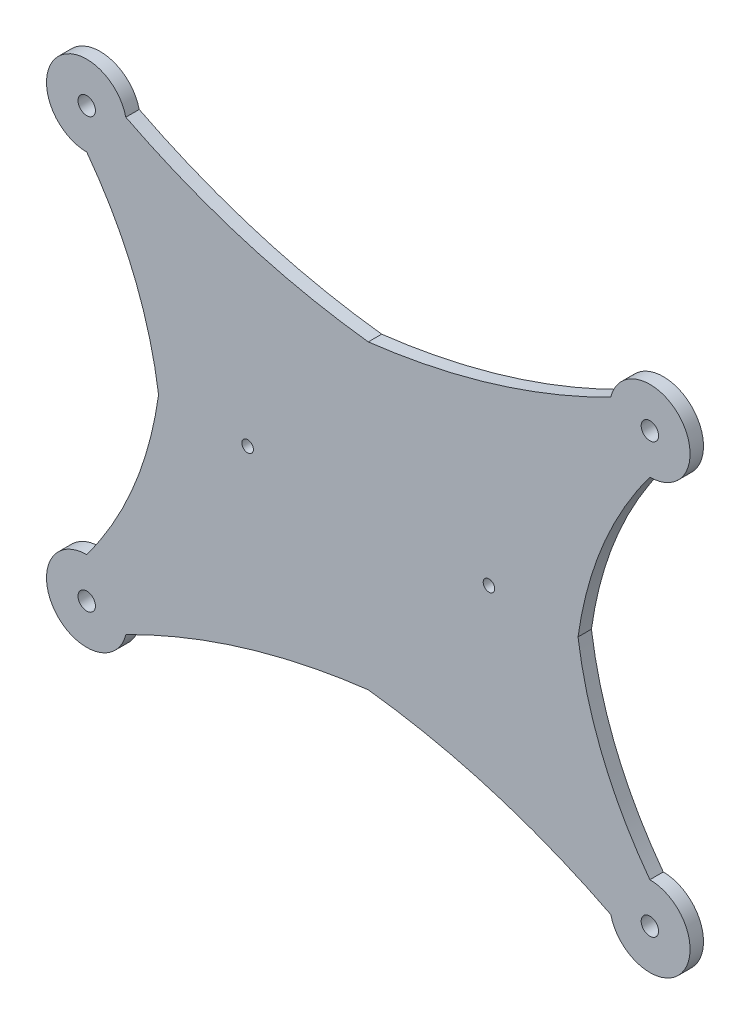
ISO-10303-21;
HEADER;
FILE_DESCRIPTION(('STEP AP214'),'2;1');
FILE_NAME('part.step','',(''),(''),'','','');
FILE_SCHEMA(('AUTOMOTIVE_DESIGN { 1 0 10303 214 1 1 1 1 }'));
ENDSEC;
DATA;
#1=APPLICATION_CONTEXT('core data for automotive mechanical design processes');
#2=APPLICATION_PROTOCOL_DEFINITION('international standard','automotive_design',2000,#1);
#3=PRODUCT_CONTEXT('',#1,'mechanical');
#4=PRODUCT('Part','Part','',(#3));
#5=PRODUCT_RELATED_PRODUCT_CATEGORY('part','',(#4));
#6=PRODUCT_DEFINITION_FORMATION('','',#4);
#7=PRODUCT_DEFINITION_CONTEXT('part definition',#1,'design');
#8=PRODUCT_DEFINITION('design','',#6,#7);
#9=PRODUCT_DEFINITION_SHAPE('','',#8);
#10=(LENGTH_UNIT() NAMED_UNIT(*) SI_UNIT(.MILLI.,.METRE.));
#11=(NAMED_UNIT(*) PLANE_ANGLE_UNIT() SI_UNIT($,.RADIAN.));
#12=(NAMED_UNIT(*) SI_UNIT($,.STERADIAN.) SOLID_ANGLE_UNIT());
#13=UNCERTAINTY_MEASURE_WITH_UNIT(LENGTH_MEASURE(1.E-05),#10,'distance_accuracy_value','');
#14=(GEOMETRIC_REPRESENTATION_CONTEXT(3) GLOBAL_UNCERTAINTY_ASSIGNED_CONTEXT((#13)) GLOBAL_UNIT_ASSIGNED_CONTEXT((#10,
#11,#12)) REPRESENTATION_CONTEXT('',''));
#15=CARTESIAN_POINT('',(0.,0.,0.));
#16=DIRECTION('',(0.,0.,1.));
#17=DIRECTION('',(1.,0.,0.));
#18=AXIS2_PLACEMENT_3D('',#15,#16,#17);
#19=CARTESIAN_POINT('',(40.6729122594452,56.4662157533922,5.));
#20=DIRECTION('',(0.,0.,1.));
#21=DIRECTION('',(1.,0.,0.));
#22=AXIS2_PLACEMENT_3D('',#19,#20,#21);
#23=PLANE('',#22);
#24=CARTESIAN_POINT('',(-91.7521313572,22.3539369381,5.));
#25=DIRECTION('',(0.,0.,1.));
#26=DIRECTION('',(1.,0.,0.));
#27=AXIS2_PLACEMENT_3D('',#24,#25,#26);
#28=CIRCLE('',#27,2.14999999999997);
#29=CARTESIAN_POINT('',(-89.6021313572,22.3539369381,5.));
#30=VERTEX_POINT('',#29);
#31=EDGE_CURVE('E461',#30,#30,#28,.T.);
#32=ORIENTED_EDGE('',*,*,#31,.F.);
#33=EDGE_LOOP('',(#32));
#34=FACE_BOUND('',#33,.T.);
#35=CARTESIAN_POINT('',(58.2478686428092,102.353936938088,5.));
#36=DIRECTION('',(0.,0.,1.));
#37=DIRECTION('',(1.,0.,0.));
#38=AXIS2_PLACEMENT_3D('',#35,#36,#37);
#39=CIRCLE('',#38,3.24999999999465);
#40=CARTESIAN_POINT('',(61.4978686428038,102.353936938088,5.));
#41=VERTEX_POINT('',#40);
#42=EDGE_CURVE('E477',#41,#41,#39,.T.);
#43=ORIENTED_EDGE('',*,*,#42,.F.);
#44=EDGE_LOOP('',(#43));
#45=FACE_BOUND('',#44,.T.);
#46=CARTESIAN_POINT('',(-151.752131357173,102.353936938134,5.));
#47=DIRECTION('',(0.,0.,1.));
#48=DIRECTION('',(1.,0.,0.));
#49=AXIS2_PLACEMENT_3D('',#46,#47,#48);
#50=CIRCLE('',#49,3.24999999996399);
#51=CARTESIAN_POINT('',(-148.502131357209,102.353936938134,5.));
#52=VERTEX_POINT('',#51);
#53=EDGE_CURVE('E384',#52,#52,#50,.T.);
#54=ORIENTED_EDGE('',*,*,#53,.F.);
#55=EDGE_LOOP('',(#54));
#56=FACE_BOUND('',#55,.T.);
#57=CARTESIAN_POINT('',(31.4509806687507,22.3539369381112,5.));
#58=CARTESIAN_POINT('',(34.8145934649779,46.1703086918168,5.));
#59=CARTESIAN_POINT('',(43.7468894563434,67.8369753584859,5.));
#60=CARTESIAN_POINT('',(58.2478686428473,87.3539369381183,5.));
#61=(BOUNDED_CURVE() B_SPLINE_CURVE(3,(#57,#58,#59,#60),.UNSPECIFIED.,.F.,
.F.) B_SPLINE_CURVE_WITH_KNOTS((4,4),(0.,1.),
.UNSPECIFIED.) CURVE() GEOMETRIC_REPRESENTATION_ITEM() RATIONAL_B_SPLINE_CURVE((1.,1.,1.,1.)) REPRESENTATION_ITEM(''));
#62=CARTESIAN_POINT('',(31.4509806687507,22.3539369381112,5.));
#63=VERTEX_POINT('',#62);
#64=CARTESIAN_POINT('',(58.2478686428473,87.3539369381183,5.));
#65=VERTEX_POINT('',#64);
#66=EDGE_CURVE('E374',#63,#65,#61,.T.);
#67=ORIENTED_EDGE('',*,*,#66,.T.);
#68=CARTESIAN_POINT('',(58.2478686428092,102.353936938088,5.));
#69=DIRECTION('',(0.,0.,1.));
#70=DIRECTION('',(1.,0.,0.));
#71=AXIS2_PLACEMENT_3D('',#68,#69,#70);
#72=CIRCLE('',#71,14.99999999997);
#73=CARTESIAN_POINT('',(43.6706456379254,105.89011700491,5.));
#74=VERTEX_POINT('',#73);
#75=EDGE_CURVE('E117',#65,#74,#72,.T.);
#76=ORIENTED_EDGE('',*,*,#75,.T.);
#77=CARTESIAN_POINT('',(43.6706456379254,105.89011700491,5.));
#78=CARTESIAN_POINT('',(15.1727780805684,91.4379292879576,5.));
#79=CARTESIAN_POINT('',(-14.9681475844576,82.320982869132,5.));
#80=CARTESIAN_POINT('',(-46.7521313571526,78.5392777484333,5.));
#81=(BOUNDED_CURVE() B_SPLINE_CURVE(3,(#77,#78,#79,#80),.UNSPECIFIED.,.F.,
.F.) B_SPLINE_CURVE_WITH_KNOTS((4,4),(0.,1.),
.UNSPECIFIED.) CURVE() GEOMETRIC_REPRESENTATION_ITEM() RATIONAL_B_SPLINE_CURVE((1.,1.,1.,1.)) REPRESENTATION_ITEM(''));
#82=CARTESIAN_POINT('',(-46.7521313571526,78.5392777484333,5.));
#83=VERTEX_POINT('',#82);
#84=EDGE_CURVE('E251',#74,#83,#81,.T.);
#85=ORIENTED_EDGE('',*,*,#84,.T.);
#86=CARTESIAN_POINT('',(-46.7521313571526,78.5392777484333,5.));
#87=CARTESIAN_POINT('',(-78.5361151298476,82.320982869132,5.));
#88=CARTESIAN_POINT('',(-108.677040794873,91.4379292879576,5.));
#89=CARTESIAN_POINT('',(-137.17490835223,105.89011700491,5.));
#90=(BOUNDED_CURVE() B_SPLINE_CURVE(3,(#86,#87,#88,#89),.UNSPECIFIED.,.F.,
.F.) B_SPLINE_CURVE_WITH_KNOTS((4,4),(0.,1.),
.UNSPECIFIED.) CURVE() GEOMETRIC_REPRESENTATION_ITEM() RATIONAL_B_SPLINE_CURVE((1.,1.,1.,1.)) REPRESENTATION_ITEM(''));
#91=CARTESIAN_POINT('',(-137.17490835223,105.89011700491,5.));
#92=VERTEX_POINT('',#91);
#93=EDGE_CURVE('E245',#83,#92,#90,.T.);
#94=ORIENTED_EDGE('',*,*,#93,.T.);
#95=CARTESIAN_POINT('',(-151.752131357173,102.353936938134,5.));
#96=DIRECTION('',(0.,0.,1.));
#97=DIRECTION('',(1.,0.,0.));
#98=AXIS2_PLACEMENT_3D('',#95,#96,#97);
#99=CIRCLE('',#98,15.0000000000162);
#100=CARTESIAN_POINT('',(-151.752131357153,87.3539369381183,5.));
#101=VERTEX_POINT('',#100);
#102=EDGE_CURVE('E250',#92,#101,#99,.T.);
#103=ORIENTED_EDGE('',*,*,#102,.T.);
#104=CARTESIAN_POINT('',(-151.752131357153,87.3539369381183,5.));
#105=CARTESIAN_POINT('',(-137.251152170649,67.8369753584859,5.));
#106=CARTESIAN_POINT('',(-128.318856179283,46.1703086918168,5.));
#107=CARTESIAN_POINT('',(-124.955243383056,22.3539369381112,5.));
#108=(BOUNDED_CURVE() B_SPLINE_CURVE(3,(#104,#105,#106,#107),.UNSPECIFIED.,.F.,
.F.) B_SPLINE_CURVE_WITH_KNOTS((4,4),(0.,1.),
.UNSPECIFIED.) CURVE() GEOMETRIC_REPRESENTATION_ITEM() RATIONAL_B_SPLINE_CURVE((1.,1.,1.,1.)) REPRESENTATION_ITEM(''));
#109=CARTESIAN_POINT('',(-124.955243383056,22.3539369381112,5.));
#110=VERTEX_POINT('',#109);
#111=EDGE_CURVE('E218',#101,#110,#108,.T.);
#112=ORIENTED_EDGE('',*,*,#111,.T.);
#113=CARTESIAN_POINT('',(-124.955243383056,22.3539369381112,5.));
#114=CARTESIAN_POINT('',(-128.318856179283,-1.46243481559441,5.));
#115=CARTESIAN_POINT('',(-137.251152170648,-23.1291014822635,5.));
#116=CARTESIAN_POINT('',(-151.752131357153,-42.6460630618959,5.));
#117=(BOUNDED_CURVE() B_SPLINE_CURVE(3,(#113,#114,#115,#116),.UNSPECIFIED.,.F.,
.F.) B_SPLINE_CURVE_WITH_KNOTS((4,4),(0.,1.),
.UNSPECIFIED.) CURVE() GEOMETRIC_REPRESENTATION_ITEM() RATIONAL_B_SPLINE_CURVE((1.,1.,1.,1.)) REPRESENTATION_ITEM(''));
#118=CARTESIAN_POINT('',(-151.752131357153,-42.6460630618959,5.));
#119=VERTEX_POINT('',#118);
#120=EDGE_CURVE('E212',#110,#119,#117,.T.);
#121=ORIENTED_EDGE('',*,*,#120,.T.);
#122=CARTESIAN_POINT('',(-151.752131357184,-57.6460630619207,5.));
#123=DIRECTION('',(0.,0.,1.));
#124=DIRECTION('',(1.,0.,0.));
#125=AXIS2_PLACEMENT_3D('',#122,#123,#124);
#126=CIRCLE('',#125,15.0000000000247);
#127=CARTESIAN_POINT('',(-137.17490835223,-61.1822431286877,5.));
#128=VERTEX_POINT('',#127);
#129=EDGE_CURVE('E206',#119,#128,#126,.T.);
#130=ORIENTED_EDGE('',*,*,#129,.T.);
#131=CARTESIAN_POINT('',(-137.17490835223,-61.1822431286877,5.));
#132=CARTESIAN_POINT('',(-108.677040794873,-46.7300554117352,5.));
#133=CARTESIAN_POINT('',(-78.5361151298476,-37.6131089929095,5.));
#134=CARTESIAN_POINT('',(-46.7521313571526,-33.8314038722108,5.));
#135=(BOUNDED_CURVE() B_SPLINE_CURVE(3,(#131,#132,#133,#134),.UNSPECIFIED.,.F.,
.F.) B_SPLINE_CURVE_WITH_KNOTS((4,4),(0.,1.),
.UNSPECIFIED.) CURVE() GEOMETRIC_REPRESENTATION_ITEM() RATIONAL_B_SPLINE_CURVE((1.,1.,1.,1.)) REPRESENTATION_ITEM(''));
#136=CARTESIAN_POINT('',(-46.7521313571526,-33.8314038722108,5.));
#137=VERTEX_POINT('',#136);
#138=EDGE_CURVE('E148',#128,#137,#135,.T.);
#139=ORIENTED_EDGE('',*,*,#138,.T.);
#140=CARTESIAN_POINT('',(-46.7521313571526,-33.8314038722108,5.));
#141=CARTESIAN_POINT('',(-14.9681475844576,-37.6131089929095,5.));
#142=CARTESIAN_POINT('',(15.1727780805684,-46.7300554117352,5.));
#143=CARTESIAN_POINT('',(43.6706456379254,-61.1822431286877,5.));
#144=(BOUNDED_CURVE() B_SPLINE_CURVE(3,(#140,#141,#142,#143),.UNSPECIFIED.,.F.,
.F.) B_SPLINE_CURVE_WITH_KNOTS((4,4),(0.,1.),
.UNSPECIFIED.) CURVE() GEOMETRIC_REPRESENTATION_ITEM() RATIONAL_B_SPLINE_CURVE((1.,1.,1.,1.)) REPRESENTATION_ITEM(''));
#145=CARTESIAN_POINT('',(43.6706456379254,-61.1822431286877,5.));
#146=VERTEX_POINT('',#145);
#147=EDGE_CURVE('E142',#137,#146,#144,.T.);
#148=ORIENTED_EDGE('',*,*,#147,.T.);
#149=CARTESIAN_POINT('',(58.24786864282,-57.6460630618745,5.));
#150=DIRECTION('',(0.,0.,1.));
#151=DIRECTION('',(1.,0.,0.));
#152=AXIS2_PLACEMENT_3D('',#149,#150,#151);
#153=CIRCLE('',#152,14.9999999999786);
#154=CARTESIAN_POINT('',(58.2478686428473,-42.6460630618959,5.));
#155=VERTEX_POINT('',#154);
#156=EDGE_CURVE('E146',#146,#155,#153,.T.);
#157=ORIENTED_EDGE('',*,*,#156,.T.);
#158=CARTESIAN_POINT('',(58.2478686428473,-42.6460630618959,5.));
#159=CARTESIAN_POINT('',(43.7468894563434,-23.1291014822635,5.));
#160=CARTESIAN_POINT('',(34.8145934649779,-1.46243481559441,5.));
#161=CARTESIAN_POINT('',(31.4509806687507,22.3539369381112,5.));
#162=(BOUNDED_CURVE() B_SPLINE_CURVE(3,(#158,#159,#160,#161),.UNSPECIFIED.,.F.,
.F.) B_SPLINE_CURVE_WITH_KNOTS((4,4),(0.,1.),
.UNSPECIFIED.) CURVE() GEOMETRIC_REPRESENTATION_ITEM() RATIONAL_B_SPLINE_CURVE((1.,1.,1.,1.)) REPRESENTATION_ITEM(''));
#163=EDGE_CURVE('E62',#155,#63,#162,.T.);
#164=ORIENTED_EDGE('',*,*,#163,.T.);
#165=EDGE_LOOP('',(#67,#76,#85,#94,#103,#112,#121,#130,#139,#148,#157,#164));
#166=FACE_BOUND('',#165,.T.);
#167=CARTESIAN_POINT('',(58.24786864282,-57.6460630618745,5.));
#168=DIRECTION('',(0.,0.,1.));
#169=DIRECTION('',(1.,0.,0.));
#170=AXIS2_PLACEMENT_3D('',#167,#168,#169);
#171=CIRCLE('',#170,3.24999999997341);
#172=CARTESIAN_POINT('',(61.4978686427934,-57.6460630618745,5.));
#173=VERTEX_POINT('',#172);
#174=EDGE_CURVE('E393',#173,#173,#171,.T.);
#175=ORIENTED_EDGE('',*,*,#174,.F.);
#176=EDGE_LOOP('',(#175));
#177=FACE_BOUND('',#176,.T.);
#178=CARTESIAN_POINT('',(-1.7521313572,22.3539369381,5.));
#179=DIRECTION('',(0.,0.,1.));
#180=DIRECTION('',(1.,0.,0.));
#181=AXIS2_PLACEMENT_3D('',#178,#179,#180);
#182=CIRCLE('',#181,2.15);
#183=CARTESIAN_POINT('',(0.397868642799999,22.3539369381,5.));
#184=VERTEX_POINT('',#183);
#185=EDGE_CURVE('E469',#184,#184,#182,.T.);
#186=ORIENTED_EDGE('',*,*,#185,.F.);
#187=EDGE_LOOP('',(#186));
#188=FACE_BOUND('',#187,.T.);
#189=CARTESIAN_POINT('',(-151.752131357184,-57.6460630619207,5.));
#190=DIRECTION('',(0.,0.,1.));
#191=DIRECTION('',(1.,0.,0.));
#192=AXIS2_PLACEMENT_3D('',#189,#190,#191);
#193=CIRCLE('',#192,3.24999999999052);
#194=CARTESIAN_POINT('',(-148.502131357193,-57.6460630619207,5.));
#195=VERTEX_POINT('',#194);
#196=EDGE_CURVE('E450',#195,#195,#193,.T.);
#197=ORIENTED_EDGE('',*,*,#196,.F.);
#198=EDGE_LOOP('',(#197));
#199=FACE_BOUND('',#198,.T.);
#200=ADVANCED_FACE('F43',(#34,#45,#56,#166,#177,#188,#199),#23,.T.);
#201=CARTESIAN_POINT('',(40.6729122594452,56.4662157533922,0.));
#202=DIRECTION('',(0.,0.,1.));
#203=DIRECTION('',(1.,0.,0.));
#204=AXIS2_PLACEMENT_3D('',#201,#202,#203);
#205=PLANE('',#204);
#206=CARTESIAN_POINT('',(31.4509806687507,22.3539369381112,0.));
#207=CARTESIAN_POINT('',(34.8145934649779,46.1703086918168,0.));
#208=CARTESIAN_POINT('',(43.7468894563434,67.8369753584859,0.));
#209=CARTESIAN_POINT('',(58.2478686428473,87.3539369381183,0.));
#210=(BOUNDED_CURVE() B_SPLINE_CURVE(3,(#206,#207,#208,#209),.UNSPECIFIED.,.F.,
.F.) B_SPLINE_CURVE_WITH_KNOTS((4,4),(0.,1.),
.UNSPECIFIED.) CURVE() GEOMETRIC_REPRESENTATION_ITEM() RATIONAL_B_SPLINE_CURVE((1.,1.,1.,1.)) REPRESENTATION_ITEM(''));
#211=CARTESIAN_POINT('',(31.4509806687507,22.3539369381112,0.));
#212=VERTEX_POINT('',#211);
#213=CARTESIAN_POINT('',(58.2478686428473,87.3539369381183,0.));
#214=VERTEX_POINT('',#213);
#215=EDGE_CURVE('E176',#212,#214,#210,.T.);
#216=ORIENTED_EDGE('',*,*,#215,.F.);
#217=CARTESIAN_POINT('',(58.2478686428473,-42.6460630618959,0.));
#218=CARTESIAN_POINT('',(43.7468894563434,-23.1291014822635,0.));
#219=CARTESIAN_POINT('',(34.8145934649779,-1.46243481559441,0.));
#220=CARTESIAN_POINT('',(31.4509806687507,22.3539369381112,0.));
#221=(BOUNDED_CURVE() B_SPLINE_CURVE(3,(#217,#218,#219,#220),.UNSPECIFIED.,.F.,
.F.) B_SPLINE_CURVE_WITH_KNOTS((4,4),(0.,1.),
.UNSPECIFIED.) CURVE() GEOMETRIC_REPRESENTATION_ITEM() RATIONAL_B_SPLINE_CURVE((1.,1.,1.,1.)) REPRESENTATION_ITEM(''));
#222=CARTESIAN_POINT('',(58.2478686428473,-42.6460630618959,0.));
#223=VERTEX_POINT('',#222);
#224=EDGE_CURVE('E109',#223,#212,#221,.T.);
#225=ORIENTED_EDGE('',*,*,#224,.F.);
#226=CARTESIAN_POINT('',(58.24786864282,-57.6460630618745,0.));
#227=DIRECTION('',(0.,0.,1.));
#228=DIRECTION('',(1.,0.,0.));
#229=AXIS2_PLACEMENT_3D('',#226,#227,#228);
#230=CIRCLE('',#229,14.9999999999786);
#231=CARTESIAN_POINT('',(43.6706456379254,-61.1822431286877,0.));
#232=VERTEX_POINT('',#231);
#233=EDGE_CURVE('E103',#232,#223,#230,.T.);
#234=ORIENTED_EDGE('',*,*,#233,.F.);
#235=CARTESIAN_POINT('',(-46.7521313571526,-33.8314038722108,0.));
#236=CARTESIAN_POINT('',(-14.9681475844576,-37.6131089929095,0.));
#237=CARTESIAN_POINT('',(15.1727780805684,-46.7300554117352,0.));
#238=CARTESIAN_POINT('',(43.6706456379254,-61.1822431286877,0.));
#239=(BOUNDED_CURVE() B_SPLINE_CURVE(3,(#235,#236,#237,#238),.UNSPECIFIED.,.F.,
.F.) B_SPLINE_CURVE_WITH_KNOTS((4,4),(0.,1.),
.UNSPECIFIED.) CURVE() GEOMETRIC_REPRESENTATION_ITEM() RATIONAL_B_SPLINE_CURVE((1.,1.,1.,1.)) REPRESENTATION_ITEM(''));
#240=CARTESIAN_POINT('',(-46.7521313571526,-33.8314038722108,0.));
#241=VERTEX_POINT('',#240);
#242=EDGE_CURVE('E157',#241,#232,#239,.T.);
#243=ORIENTED_EDGE('',*,*,#242,.F.);
#244=CARTESIAN_POINT('',(-137.17490835223,-61.1822431286877,0.));
#245=CARTESIAN_POINT('',(-108.677040794873,-46.7300554117352,0.));
#246=CARTESIAN_POINT('',(-78.5361151298476,-37.6131089929095,0.));
#247=CARTESIAN_POINT('',(-46.7521313571526,-33.8314038722108,0.));
#248=(BOUNDED_CURVE() B_SPLINE_CURVE(3,(#244,#245,#246,#247),.UNSPECIFIED.,.F.,
.F.) B_SPLINE_CURVE_WITH_KNOTS((4,4),(0.,1.),
.UNSPECIFIED.) CURVE() GEOMETRIC_REPRESENTATION_ITEM() RATIONAL_B_SPLINE_CURVE((1.,1.,1.,1.)) REPRESENTATION_ITEM(''));
#249=CARTESIAN_POINT('',(-137.17490835223,-61.1822431286877,0.));
#250=VERTEX_POINT('',#249);
#251=EDGE_CURVE('E291',#250,#241,#248,.T.);
#252=ORIENTED_EDGE('',*,*,#251,.F.);
#253=CARTESIAN_POINT('',(-151.752131357184,-57.6460630619207,0.));
#254=DIRECTION('',(0.,0.,1.));
#255=DIRECTION('',(1.,0.,0.));
#256=AXIS2_PLACEMENT_3D('',#253,#254,#255);
#257=CIRCLE('',#256,15.0000000000247);
#258=CARTESIAN_POINT('',(-151.752131357153,-42.6460630618959,0.));
#259=VERTEX_POINT('',#258);
#260=EDGE_CURVE('E287',#259,#250,#257,.T.);
#261=ORIENTED_EDGE('',*,*,#260,.F.);
#262=CARTESIAN_POINT('',(-124.955243383056,22.3539369381112,0.));
#263=CARTESIAN_POINT('',(-128.318856179283,-1.46243481559441,0.));
#264=CARTESIAN_POINT('',(-137.251152170648,-23.1291014822635,0.));
#265=CARTESIAN_POINT('',(-151.752131357153,-42.6460630618959,0.));
#266=(BOUNDED_CURVE() B_SPLINE_CURVE(3,(#262,#263,#264,#265),.UNSPECIFIED.,.F.,
.F.) B_SPLINE_CURVE_WITH_KNOTS((4,4),(0.,1.),
.UNSPECIFIED.) CURVE() GEOMETRIC_REPRESENTATION_ITEM() RATIONAL_B_SPLINE_CURVE((1.,1.,1.,1.)) REPRESENTATION_ITEM(''));
#267=CARTESIAN_POINT('',(-124.955243383056,22.3539369381112,0.));
#268=VERTEX_POINT('',#267);
#269=EDGE_CURVE('E279',#268,#259,#266,.T.);
#270=ORIENTED_EDGE('',*,*,#269,.F.);
#271=CARTESIAN_POINT('',(-151.752131357153,87.3539369381183,0.));
#272=CARTESIAN_POINT('',(-137.251152170649,67.8369753584859,0.));
#273=CARTESIAN_POINT('',(-128.318856179283,46.1703086918168,0.));
#274=CARTESIAN_POINT('',(-124.955243383056,22.3539369381112,0.));
#275=(BOUNDED_CURVE() B_SPLINE_CURVE(3,(#271,#272,#273,#274),.UNSPECIFIED.,.F.,
.F.) B_SPLINE_CURVE_WITH_KNOTS((4,4),(0.,1.),
.UNSPECIFIED.) CURVE() GEOMETRIC_REPRESENTATION_ITEM() RATIONAL_B_SPLINE_CURVE((1.,1.,1.,1.)) REPRESENTATION_ITEM(''));
#276=CARTESIAN_POINT('',(-151.752131357153,87.3539369381183,0.));
#277=VERTEX_POINT('',#276);
#278=EDGE_CURVE('E271',#277,#268,#275,.T.);
#279=ORIENTED_EDGE('',*,*,#278,.F.);
#280=CARTESIAN_POINT('',(-151.752131357173,102.353936938134,0.));
#281=DIRECTION('',(0.,0.,1.));
#282=DIRECTION('',(1.,0.,0.));
#283=AXIS2_PLACEMENT_3D('',#280,#281,#282);
#284=CIRCLE('',#283,15.0000000000162);
#285=CARTESIAN_POINT('',(-137.17490835223,105.89011700491,0.));
#286=VERTEX_POINT('',#285);
#287=EDGE_CURVE('E323',#286,#277,#284,.T.);
#288=ORIENTED_EDGE('',*,*,#287,.F.);
#289=CARTESIAN_POINT('',(-46.7521313571526,78.5392777484333,0.));
#290=CARTESIAN_POINT('',(-78.5361151298476,82.320982869132,0.));
#291=CARTESIAN_POINT('',(-108.677040794873,91.4379292879576,0.));
#292=CARTESIAN_POINT('',(-137.17490835223,105.89011700491,0.));
#293=(BOUNDED_CURVE() B_SPLINE_CURVE(3,(#289,#290,#291,#292),.UNSPECIFIED.,.F.,
.F.) B_SPLINE_CURVE_WITH_KNOTS((4,4),(0.,1.),
.UNSPECIFIED.) CURVE() GEOMETRIC_REPRESENTATION_ITEM() RATIONAL_B_SPLINE_CURVE((1.,1.,1.,1.)) REPRESENTATION_ITEM(''));
#294=CARTESIAN_POINT('',(-46.7521313571526,78.5392777484333,0.));
#295=VERTEX_POINT('',#294);
#296=EDGE_CURVE('E318',#295,#286,#293,.T.);
#297=ORIENTED_EDGE('',*,*,#296,.F.);
#298=CARTESIAN_POINT('',(43.6706456379254,105.89011700491,0.));
#299=CARTESIAN_POINT('',(15.1727780805684,91.4379292879576,0.));
#300=CARTESIAN_POINT('',(-14.9681475844576,82.320982869132,0.));
#301=CARTESIAN_POINT('',(-46.7521313571526,78.5392777484333,0.));
#302=(BOUNDED_CURVE() B_SPLINE_CURVE(3,(#298,#299,#300,#301),.UNSPECIFIED.,.F.,
.F.) B_SPLINE_CURVE_WITH_KNOTS((4,4),(0.,1.),
.UNSPECIFIED.) CURVE() GEOMETRIC_REPRESENTATION_ITEM() RATIONAL_B_SPLINE_CURVE((1.,1.,1.,1.)) REPRESENTATION_ITEM(''));
#303=CARTESIAN_POINT('',(43.6706456379254,105.89011700491,0.));
#304=VERTEX_POINT('',#303);
#305=EDGE_CURVE('E311',#304,#295,#302,.T.);
#306=ORIENTED_EDGE('',*,*,#305,.F.);
#307=CARTESIAN_POINT('',(58.2478686428092,102.353936938088,0.));
#308=DIRECTION('',(0.,0.,1.));
#309=DIRECTION('',(1.,0.,0.));
#310=AXIS2_PLACEMENT_3D('',#307,#308,#309);
#311=CIRCLE('',#310,14.99999999997);
#312=EDGE_CURVE('E316',#214,#304,#311,.T.);
#313=ORIENTED_EDGE('',*,*,#312,.F.);
#314=EDGE_LOOP('',(#216,#225,#234,#243,#252,#261,#270,#279,#288,#297,#306,#313));
#315=FACE_BOUND('',#314,.T.);
#316=CARTESIAN_POINT('',(-151.752131357173,102.353936938134,0.));
#317=DIRECTION('',(0.,0.,1.));
#318=DIRECTION('',(1.,0.,0.));
#319=AXIS2_PLACEMENT_3D('',#316,#317,#318);
#320=CIRCLE('',#319,3.24999999996399);
#321=CARTESIAN_POINT('',(-148.502131357209,102.353936938134,0.));
#322=VERTEX_POINT('',#321);
#323=EDGE_CURVE('E387',#322,#322,#320,.T.);
#324=ORIENTED_EDGE('',*,*,#323,.T.);
#325=EDGE_LOOP('',(#324));
#326=FACE_BOUND('',#325,.T.);
#327=CARTESIAN_POINT('',(58.24786864282,-57.6460630618745,0.));
#328=DIRECTION('',(0.,0.,1.));
#329=DIRECTION('',(1.,0.,0.));
#330=AXIS2_PLACEMENT_3D('',#327,#328,#329);
#331=CIRCLE('',#330,3.24999999997341);
#332=CARTESIAN_POINT('',(61.4978686427934,-57.6460630618745,0.));
#333=VERTEX_POINT('',#332);
#334=EDGE_CURVE('E396',#333,#333,#331,.T.);
#335=ORIENTED_EDGE('',*,*,#334,.T.);
#336=EDGE_LOOP('',(#335));
#337=FACE_BOUND('',#336,.T.);
#338=CARTESIAN_POINT('',(58.2478686428092,102.353936938088,0.));
#339=DIRECTION('',(0.,0.,1.));
#340=DIRECTION('',(1.,0.,0.));
#341=AXIS2_PLACEMENT_3D('',#338,#339,#340);
#342=CIRCLE('',#341,3.24999999999465);
#343=CARTESIAN_POINT('',(61.4978686428038,102.353936938088,0.));
#344=VERTEX_POINT('',#343);
#345=EDGE_CURVE('E473',#344,#344,#342,.T.);
#346=ORIENTED_EDGE('',*,*,#345,.T.);
#347=EDGE_LOOP('',(#346));
#348=FACE_BOUND('',#347,.T.);
#349=CARTESIAN_POINT('',(-1.7521313572,22.3539369381,0.));
#350=DIRECTION('',(0.,0.,1.));
#351=DIRECTION('',(1.,0.,0.));
#352=AXIS2_PLACEMENT_3D('',#349,#350,#351);
#353=CIRCLE('',#352,2.15);
#354=CARTESIAN_POINT('',(0.397868642799999,22.3539369381,0.));
#355=VERTEX_POINT('',#354);
#356=EDGE_CURVE('E465',#355,#355,#353,.T.);
#357=ORIENTED_EDGE('',*,*,#356,.T.);
#358=EDGE_LOOP('',(#357));
#359=FACE_BOUND('',#358,.T.);
#360=CARTESIAN_POINT('',(-91.7521313572,22.3539369381,0.));
#361=DIRECTION('',(0.,0.,1.));
#362=DIRECTION('',(1.,0.,0.));
#363=AXIS2_PLACEMENT_3D('',#360,#361,#362);
#364=CIRCLE('',#363,2.14999999999997);
#365=CARTESIAN_POINT('',(-89.6021313572,22.3539369381,0.));
#366=VERTEX_POINT('',#365);
#367=EDGE_CURVE('E458',#366,#366,#364,.T.);
#368=ORIENTED_EDGE('',*,*,#367,.T.);
#369=EDGE_LOOP('',(#368));
#370=FACE_BOUND('',#369,.T.);
#371=CARTESIAN_POINT('',(-151.752131357184,-57.6460630619207,0.));
#372=DIRECTION('',(0.,0.,1.));
#373=DIRECTION('',(1.,0.,0.));
#374=AXIS2_PLACEMENT_3D('',#371,#372,#373);
#375=CIRCLE('',#374,3.24999999999052);
#376=CARTESIAN_POINT('',(-148.502131357193,-57.6460630619207,0.));
#377=VERTEX_POINT('',#376);
#378=EDGE_CURVE('E453',#377,#377,#375,.T.);
#379=ORIENTED_EDGE('',*,*,#378,.T.);
#380=EDGE_LOOP('',(#379));
#381=FACE_BOUND('',#380,.T.);
#382=ADVANCED_FACE('F189',(#315,#326,#337,#348,#359,#370,#381),#205,.F.);
#383=DIRECTION('',(0.,0.,-1.));
#384=VECTOR('',#383,1.);
#385=SURFACE_OF_LINEAR_EXTRUSION('',#61,#384);
#386=ORIENTED_EDGE('',*,*,#215,.T.);
#387=DIRECTION('',(0.,0.,-1.));
#388=VECTOR('',#387,1.);
#389=CARTESIAN_POINT('',(58.2478686428473,87.3539369381183,5.));
#390=LINE('',#389,#388);
#391=EDGE_CURVE('E11',#65,#214,#390,.T.);
#392=ORIENTED_EDGE('',*,*,#391,.F.);
#393=ORIENTED_EDGE('',*,*,#66,.F.);
#394=DIRECTION('',(0.,0.,-1.));
#395=VECTOR('',#394,1.);
#396=CARTESIAN_POINT('',(31.4509806687507,22.3539369381112,5.));
#397=LINE('',#396,#395);
#398=EDGE_CURVE('E166',#63,#212,#397,.T.);
#399=ORIENTED_EDGE('',*,*,#398,.T.);
#400=EDGE_LOOP('',(#386,#392,#393,#399));
#401=FACE_BOUND('',#400,.T.);
#402=ADVANCED_FACE('F45',(#401),#385,.F.);
#403=CARTESIAN_POINT('',(58.2478686428092,102.353936938088,5.));
#404=DIRECTION('',(0.,0.,-1.));
#405=DIRECTION('',(-1.,0.,0.));
#406=AXIS2_PLACEMENT_3D('',#403,#404,#405);
#407=CYLINDRICAL_SURFACE('',#406,14.99999999997);
#408=ORIENTED_EDGE('',*,*,#312,.T.);
#409=DIRECTION('',(0.,0.,-1.));
#410=VECTOR('',#409,1.);
#411=CARTESIAN_POINT('',(43.6706456379254,105.89011700491,5.));
#412=LINE('',#411,#410);
#413=EDGE_CURVE('E54',#74,#304,#412,.T.);
#414=ORIENTED_EDGE('',*,*,#413,.F.);
#415=ORIENTED_EDGE('',*,*,#75,.F.);
#416=ORIENTED_EDGE('',*,*,#391,.T.);
#417=EDGE_LOOP('',(#408,#414,#415,#416));
#418=FACE_BOUND('',#417,.T.);
#419=ADVANCED_FACE('F410',(#418),#407,.T.);
#420=DIRECTION('',(0.,0.,-1.));
#421=VECTOR('',#420,1.);
#422=SURFACE_OF_LINEAR_EXTRUSION('',#81,#421);
#423=ORIENTED_EDGE('',*,*,#305,.T.);
#424=DIRECTION('',(0.,0.,-1.));
#425=VECTOR('',#424,1.);
#426=CARTESIAN_POINT('',(-46.7521313571526,78.5392777484333,5.));
#427=LINE('',#426,#425);
#428=EDGE_CURVE('E302',#83,#295,#427,.T.);
#429=ORIENTED_EDGE('',*,*,#428,.F.);
#430=ORIENTED_EDGE('',*,*,#84,.F.);
#431=ORIENTED_EDGE('',*,*,#413,.T.);
#432=EDGE_LOOP('',(#423,#429,#430,#431));
#433=FACE_BOUND('',#432,.T.);
#434=ADVANCED_FACE('F242',(#433),#422,.F.);
#435=DIRECTION('',(0.,0.,-1.));
#436=VECTOR('',#435,1.);
#437=SURFACE_OF_LINEAR_EXTRUSION('',#90,#436);
#438=ORIENTED_EDGE('',*,*,#296,.T.);
#439=DIRECTION('',(0.,0.,-1.));
#440=VECTOR('',#439,1.);
#441=CARTESIAN_POINT('',(-137.17490835223,105.89011700491,5.));
#442=LINE('',#441,#440);
#443=EDGE_CURVE('E298',#92,#286,#442,.T.);
#444=ORIENTED_EDGE('',*,*,#443,.F.);
#445=ORIENTED_EDGE('',*,*,#93,.F.);
#446=ORIENTED_EDGE('',*,*,#428,.T.);
#447=EDGE_LOOP('',(#438,#444,#445,#446));
#448=FACE_BOUND('',#447,.T.);
#449=ADVANCED_FACE('F237',(#448),#437,.F.);
#450=CARTESIAN_POINT('',(-151.752131357173,102.353936938134,5.));
#451=DIRECTION('',(0.,0.,-1.));
#452=DIRECTION('',(-1.,0.,0.));
#453=AXIS2_PLACEMENT_3D('',#450,#451,#452);
#454=CYLINDRICAL_SURFACE('',#453,15.0000000000162);
#455=ORIENTED_EDGE('',*,*,#287,.T.);
#456=DIRECTION('',(0.,0.,-1.));
#457=VECTOR('',#456,1.);
#458=CARTESIAN_POINT('',(-151.752131357153,87.3539369381183,5.));
#459=LINE('',#458,#457);
#460=EDGE_CURVE('E274',#101,#277,#459,.T.);
#461=ORIENTED_EDGE('',*,*,#460,.F.);
#462=ORIENTED_EDGE('',*,*,#102,.F.);
#463=ORIENTED_EDGE('',*,*,#443,.T.);
#464=EDGE_LOOP('',(#455,#461,#462,#463));
#465=FACE_BOUND('',#464,.T.);
#466=ADVANCED_FACE('F233',(#465),#454,.T.);
#467=DIRECTION('',(0.,0.,-1.));
#468=VECTOR('',#467,1.);
#469=SURFACE_OF_LINEAR_EXTRUSION('',#108,#468);
#470=ORIENTED_EDGE('',*,*,#278,.T.);
#471=DIRECTION('',(0.,0.,-1.));
#472=VECTOR('',#471,1.);
#473=CARTESIAN_POINT('',(-124.955243383056,22.3539369381112,5.));
#474=LINE('',#473,#472);
#475=EDGE_CURVE('E269',#110,#268,#474,.T.);
#476=ORIENTED_EDGE('',*,*,#475,.F.);
#477=ORIENTED_EDGE('',*,*,#111,.F.);
#478=ORIENTED_EDGE('',*,*,#460,.T.);
#479=EDGE_LOOP('',(#470,#476,#477,#478));
#480=FACE_BOUND('',#479,.T.);
#481=ADVANCED_FACE('F229',(#480),#469,.F.);
#482=DIRECTION('',(0.,0.,-1.));
#483=VECTOR('',#482,1.);
#484=SURFACE_OF_LINEAR_EXTRUSION('',#117,#483);
#485=ORIENTED_EDGE('',*,*,#269,.T.);
#486=DIRECTION('',(0.,0.,-1.));
#487=VECTOR('',#486,1.);
#488=CARTESIAN_POINT('',(-151.752131357153,-42.6460630618959,5.));
#489=LINE('',#488,#487);
#490=EDGE_CURVE('E275',#119,#259,#489,.T.);
#491=ORIENTED_EDGE('',*,*,#490,.F.);
#492=ORIENTED_EDGE('',*,*,#120,.F.);
#493=ORIENTED_EDGE('',*,*,#475,.T.);
#494=EDGE_LOOP('',(#485,#491,#492,#493));
#495=FACE_BOUND('',#494,.T.);
#496=ADVANCED_FACE('F226',(#495),#484,.F.);
#497=CARTESIAN_POINT('',(-151.752131357184,-57.6460630619207,5.));
#498=DIRECTION('',(0.,0.,-1.));
#499=DIRECTION('',(-1.,0.,0.));
#500=AXIS2_PLACEMENT_3D('',#497,#498,#499);
#501=CYLINDRICAL_SURFACE('',#500,15.0000000000247);
#502=ORIENTED_EDGE('',*,*,#260,.T.);
#503=DIRECTION('',(0.,0.,-1.));
#504=VECTOR('',#503,1.);
#505=CARTESIAN_POINT('',(-137.17490835223,-61.1822431286877,5.));
#506=LINE('',#505,#504);
#507=EDGE_CURVE('E283',#128,#250,#506,.T.);
#508=ORIENTED_EDGE('',*,*,#507,.F.);
#509=ORIENTED_EDGE('',*,*,#129,.F.);
#510=ORIENTED_EDGE('',*,*,#490,.T.);
#511=EDGE_LOOP('',(#502,#508,#509,#510));
#512=FACE_BOUND('',#511,.T.);
#513=ADVANCED_FACE('F198',(#512),#501,.T.);
#514=DIRECTION('',(0.,0.,-1.));
#515=VECTOR('',#514,1.);
#516=SURFACE_OF_LINEAR_EXTRUSION('',#135,#515);
#517=ORIENTED_EDGE('',*,*,#251,.T.);
#518=DIRECTION('',(0.,0.,-1.));
#519=VECTOR('',#518,1.);
#520=CARTESIAN_POINT('',(-46.7521313571526,-33.8314038722108,5.));
#521=LINE('',#520,#519);
#522=EDGE_CURVE('E159',#137,#241,#521,.T.);
#523=ORIENTED_EDGE('',*,*,#522,.F.);
#524=ORIENTED_EDGE('',*,*,#138,.F.);
#525=ORIENTED_EDGE('',*,*,#507,.T.);
#526=EDGE_LOOP('',(#517,#523,#524,#525));
#527=FACE_BOUND('',#526,.T.);
#528=ADVANCED_FACE('F195',(#527),#516,.F.);
#529=DIRECTION('',(0.,0.,-1.));
#530=VECTOR('',#529,1.);
#531=SURFACE_OF_LINEAR_EXTRUSION('',#144,#530);
#532=ORIENTED_EDGE('',*,*,#242,.T.);
#533=DIRECTION('',(0.,0.,-1.));
#534=VECTOR('',#533,1.);
#535=CARTESIAN_POINT('',(43.6706456379254,-61.1822431286877,5.));
#536=LINE('',#535,#534);
#537=EDGE_CURVE('E154',#146,#232,#536,.T.);
#538=ORIENTED_EDGE('',*,*,#537,.F.);
#539=ORIENTED_EDGE('',*,*,#147,.F.);
#540=ORIENTED_EDGE('',*,*,#522,.T.);
#541=EDGE_LOOP('',(#532,#538,#539,#540));
#542=FACE_BOUND('',#541,.T.);
#543=ADVANCED_FACE('F155',(#542),#531,.F.);
#544=CARTESIAN_POINT('',(58.24786864282,-57.6460630618745,5.));
#545=DIRECTION('',(0.,0.,-1.));
#546=DIRECTION('',(-1.,0.,0.));
#547=AXIS2_PLACEMENT_3D('',#544,#545,#546);
#548=CYLINDRICAL_SURFACE('',#547,14.9999999999786);
#549=ORIENTED_EDGE('',*,*,#233,.T.);
#550=DIRECTION('',(0.,0.,-1.));
#551=VECTOR('',#550,1.);
#552=CARTESIAN_POINT('',(58.2478686428473,-42.6460630618959,5.));
#553=LINE('',#552,#551);
#554=EDGE_CURVE('E160',#155,#223,#553,.T.);
#555=ORIENTED_EDGE('',*,*,#554,.F.);
#556=ORIENTED_EDGE('',*,*,#156,.F.);
#557=ORIENTED_EDGE('',*,*,#537,.T.);
#558=EDGE_LOOP('',(#549,#555,#556,#557));
#559=FACE_BOUND('',#558,.T.);
#560=ADVANCED_FACE('F162',(#559),#548,.T.);
#561=DIRECTION('',(0.,0.,-1.));
#562=VECTOR('',#561,1.);
#563=SURFACE_OF_LINEAR_EXTRUSION('',#162,#562);
#564=ORIENTED_EDGE('',*,*,#224,.T.);
#565=ORIENTED_EDGE('',*,*,#398,.F.);
#566=ORIENTED_EDGE('',*,*,#163,.F.);
#567=ORIENTED_EDGE('',*,*,#554,.T.);
#568=EDGE_LOOP('',(#564,#565,#566,#567));
#569=FACE_BOUND('',#568,.T.);
#570=ADVANCED_FACE('F184',(#569),#563,.F.);
#571=CARTESIAN_POINT('',(-151.752131357173,102.353936938134,5.));
#572=DIRECTION('',(0.,0.,-1.));
#573=DIRECTION('',(-1.,0.,0.));
#574=AXIS2_PLACEMENT_3D('',#571,#572,#573);
#575=CYLINDRICAL_SURFACE('',#574,3.24999999996399);
#576=ORIENTED_EDGE('',*,*,#53,.T.);
#577=EDGE_LOOP('',(#576));
#578=FACE_BOUND('',#577,.T.);
#579=ORIENTED_EDGE('',*,*,#323,.F.);
#580=EDGE_LOOP('',(#579));
#581=FACE_BOUND('',#580,.T.);
#582=ADVANCED_FACE('F188',(#578,#581),#575,.F.);
#583=CARTESIAN_POINT('',(58.24786864282,-57.6460630618745,5.));
#584=DIRECTION('',(0.,0.,-1.));
#585=DIRECTION('',(-1.,0.,0.));
#586=AXIS2_PLACEMENT_3D('',#583,#584,#585);
#587=CYLINDRICAL_SURFACE('',#586,3.24999999997341);
#588=ORIENTED_EDGE('',*,*,#174,.T.);
#589=EDGE_LOOP('',(#588));
#590=FACE_BOUND('',#589,.T.);
#591=ORIENTED_EDGE('',*,*,#334,.F.);
#592=EDGE_LOOP('',(#591));
#593=FACE_BOUND('',#592,.T.);
#594=ADVANCED_FACE('F426',(#590,#593),#587,.F.);
#595=CARTESIAN_POINT('',(58.2478686428092,102.353936938088,5.));
#596=DIRECTION('',(0.,0.,-1.));
#597=DIRECTION('',(-1.,0.,0.));
#598=AXIS2_PLACEMENT_3D('',#595,#596,#597);
#599=CYLINDRICAL_SURFACE('',#598,3.24999999999465);
#600=ORIENTED_EDGE('',*,*,#42,.T.);
#601=EDGE_LOOP('',(#600));
#602=FACE_BOUND('',#601,.T.);
#603=ORIENTED_EDGE('',*,*,#345,.F.);
#604=EDGE_LOOP('',(#603));
#605=FACE_BOUND('',#604,.T.);
#606=ADVANCED_FACE('F429',(#602,#605),#599,.F.);
#607=CARTESIAN_POINT('',(-1.7521313572,22.3539369381,5.));
#608=DIRECTION('',(0.,0.,-1.));
#609=DIRECTION('',(-1.,0.,0.));
#610=AXIS2_PLACEMENT_3D('',#607,#608,#609);
#611=CYLINDRICAL_SURFACE('',#610,2.15);
#612=ORIENTED_EDGE('',*,*,#185,.T.);
#613=EDGE_LOOP('',(#612));
#614=FACE_BOUND('',#613,.T.);
#615=ORIENTED_EDGE('',*,*,#356,.F.);
#616=EDGE_LOOP('',(#615));
#617=FACE_BOUND('',#616,.T.);
#618=ADVANCED_FACE('F433',(#614,#617),#611,.F.);
#619=CARTESIAN_POINT('',(-91.7521313572,22.3539369381,5.));
#620=DIRECTION('',(0.,0.,-1.));
#621=DIRECTION('',(-1.,0.,0.));
#622=AXIS2_PLACEMENT_3D('',#619,#620,#621);
#623=CYLINDRICAL_SURFACE('',#622,2.14999999999997);
#624=ORIENTED_EDGE('',*,*,#31,.T.);
#625=EDGE_LOOP('',(#624));
#626=FACE_BOUND('',#625,.T.);
#627=ORIENTED_EDGE('',*,*,#367,.F.);
#628=EDGE_LOOP('',(#627));
#629=FACE_BOUND('',#628,.T.);
#630=ADVANCED_FACE('F437',(#626,#629),#623,.F.);
#631=CARTESIAN_POINT('',(-151.752131357184,-57.6460630619207,5.));
#632=DIRECTION('',(0.,0.,-1.));
#633=DIRECTION('',(-1.,0.,0.));
#634=AXIS2_PLACEMENT_3D('',#631,#632,#633);
#635=CYLINDRICAL_SURFACE('',#634,3.24999999999052);
#636=ORIENTED_EDGE('',*,*,#196,.T.);
#637=EDGE_LOOP('',(#636));
#638=FACE_BOUND('',#637,.T.);
#639=ORIENTED_EDGE('',*,*,#378,.F.);
#640=EDGE_LOOP('',(#639));
#641=FACE_BOUND('',#640,.T.);
#642=ADVANCED_FACE('F441',(#638,#641),#635,.F.);
#643=CLOSED_SHELL('',(#200,#382,#402,#419,#434,#449,#466,#481,#496,#513,#528,#543,#560,#570,
#582,#594,#606,#618,#630,#642));
#644=MANIFOLD_SOLID_BREP('B2',#643);
#645=ADVANCED_BREP_SHAPE_REPRESENTATION('',(#18,#644),#14);
#646=SHAPE_DEFINITION_REPRESENTATION(#9,#645);
ENDSEC;
END-ISO-10303-21;
